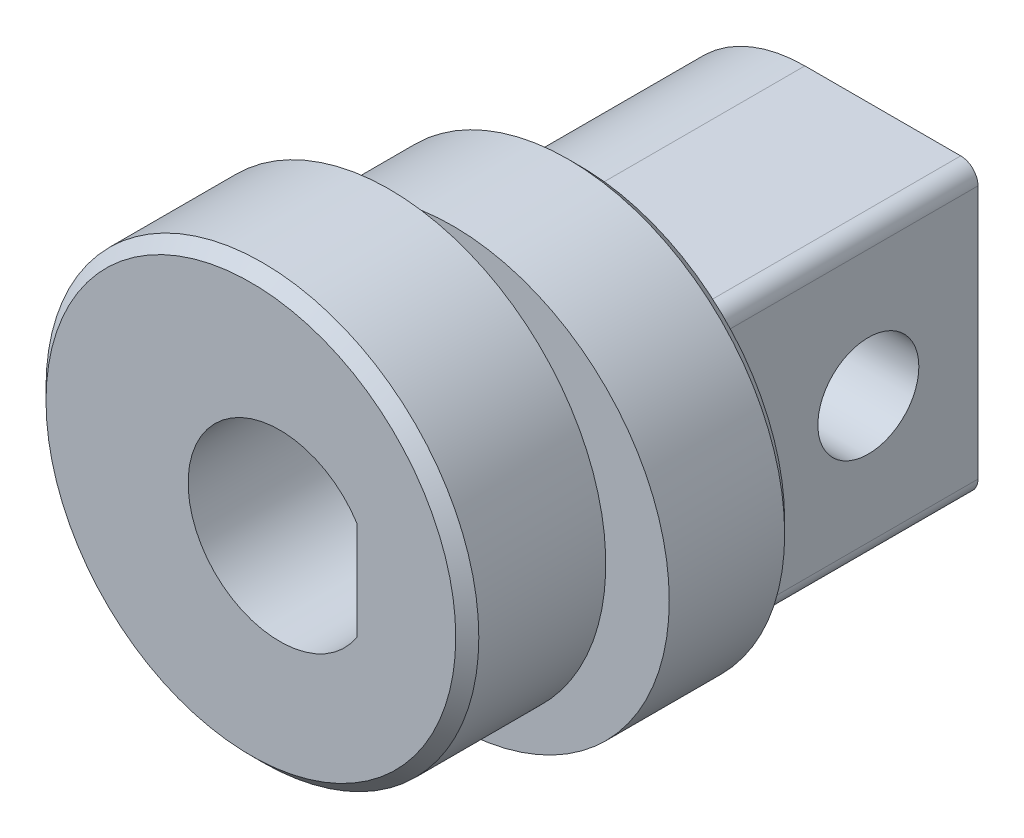
ISO-10303-21;
HEADER;
FILE_DESCRIPTION(('STEP AP214'),'2;1');
FILE_NAME('part.step','',(''),(''),'','','');
FILE_SCHEMA(('AUTOMOTIVE_DESIGN { 1 0 10303 214 1 1 1 1 }'));
ENDSEC;
DATA;
#1=APPLICATION_CONTEXT('core data for automotive mechanical design processes');
#2=APPLICATION_PROTOCOL_DEFINITION('international standard','automotive_design',2000,#1);
#3=PRODUCT_CONTEXT('',#1,'mechanical');
#4=PRODUCT('Part','Part','',(#3));
#5=PRODUCT_RELATED_PRODUCT_CATEGORY('part','',(#4));
#6=PRODUCT_DEFINITION_FORMATION('','',#4);
#7=PRODUCT_DEFINITION_CONTEXT('part definition',#1,'design');
#8=PRODUCT_DEFINITION('design','',#6,#7);
#9=PRODUCT_DEFINITION_SHAPE('','',#8);
#10=(LENGTH_UNIT() NAMED_UNIT(*) SI_UNIT(.MILLI.,.METRE.));
#11=(NAMED_UNIT(*) PLANE_ANGLE_UNIT() SI_UNIT($,.RADIAN.));
#12=(NAMED_UNIT(*) SI_UNIT($,.STERADIAN.) SOLID_ANGLE_UNIT());
#13=UNCERTAINTY_MEASURE_WITH_UNIT(LENGTH_MEASURE(1.E-05),#10,'distance_accuracy_value','');
#14=(GEOMETRIC_REPRESENTATION_CONTEXT(3) GLOBAL_UNCERTAINTY_ASSIGNED_CONTEXT((#13)) GLOBAL_UNIT_ASSIGNED_CONTEXT((#10,
#11,#12)) REPRESENTATION_CONTEXT('',''));
#15=CARTESIAN_POINT('',(0.,0.,0.));
#16=DIRECTION('',(0.,0.,1.));
#17=DIRECTION('',(1.,0.,0.));
#18=AXIS2_PLACEMENT_3D('',#15,#16,#17);
#19=CARTESIAN_POINT('',(2.675,-1.71026313764871,-8.79999999993873));
#20=DIRECTION('',(1.,0.,0.));
#21=DIRECTION('',(0.,0.,-1.));
#22=AXIS2_PLACEMENT_3D('',#19,#20,#21);
#23=PLANE('',#22);
#24=DIRECTION('',(0.,0.,1.));
#25=VECTOR('',#24,1.);
#26=CARTESIAN_POINT('',(2.675,1.71026313764871,-8.79999999993873));
#27=LINE('',#26,#25);
#28=CARTESIAN_POINT('',(2.675,1.71026313764871,-4.62919007564525));
#29=VERTEX_POINT('',#28);
#30=CARTESIAN_POINT('',(2.675,1.71026313764871,9.4));
#31=VERTEX_POINT('',#30);
#32=EDGE_CURVE('E148',#29,#31,#27,.T.);
#33=ORIENTED_EDGE('',*,*,#32,.F.);
#34=CARTESIAN_POINT('',(2.675,0.,-5.));
#35=DIRECTION('',(1.,0.,0.));
#36=DIRECTION('',(0.,0.,-1.));
#37=AXIS2_PLACEMENT_3D('',#34,#35,#36);
#38=CIRCLE('',#37,1.74999999999999);
#39=CARTESIAN_POINT('',(2.675,-1.71026313764871,-4.62919007564525));
#40=VERTEX_POINT('',#39);
#41=EDGE_CURVE('E61',#29,#40,#38,.T.);
#42=ORIENTED_EDGE('',*,*,#41,.T.);
#43=DIRECTION('',(0.,0.,1.));
#44=VECTOR('',#43,1.);
#45=CARTESIAN_POINT('',(2.675,-1.71026313764871,-8.79999999993873));
#46=LINE('',#45,#44);
#47=CARTESIAN_POINT('',(2.675,-1.71026313764871,9.4));
#48=VERTEX_POINT('',#47);
#49=EDGE_CURVE('E156',#40,#48,#46,.T.);
#50=ORIENTED_EDGE('',*,*,#49,.T.);
#51=DIRECTION('',(0.,1.,0.));
#52=VECTOR('',#51,1.);
#53=CARTESIAN_POINT('',(2.675,-1.71026313764871,9.4));
#54=LINE('',#53,#52);
#55=EDGE_CURVE('E154',#48,#31,#54,.T.);
#56=ORIENTED_EDGE('',*,*,#55,.T.);
#57=EDGE_LOOP('',(#33,#42,#50,#56));
#58=FACE_BOUND('',#57,.T.);
#59=ADVANCED_FACE('F45',(#58),#23,.F.);
#60=CARTESIAN_POINT('',(1.2,0.,0.200000000013279));
#61=DIRECTION('',(0.,0.,1.));
#62=DIRECTION('',(1.,0.,0.));
#63=AXIS2_PLACEMENT_3D('',#60,#61,#62);
#64=PLANE('',#63);
#65=CARTESIAN_POINT('',(1.2,0.,0.200000000013279));
#66=DIRECTION('',(0.,0.,1.));
#67=DIRECTION('',(1.,0.,0.));
#68=AXIS2_PLACEMENT_3D('',#65,#66,#67);
#69=CIRCLE('',#68,7.10000000004356);
#70=CARTESIAN_POINT('',(8.30000000004356,0.,0.200000000013279));
#71=VERTEX_POINT('',#70);
#72=EDGE_CURVE('E319',#71,#71,#69,.F.);
#73=ORIENTED_EDGE('',*,*,#72,.T.);
#74=EDGE_LOOP('',(#73));
#75=FACE_BOUND('',#74,.T.);
#76=CARTESIAN_POINT('',(5.4,4.4,0.200000000013279));
#77=DIRECTION('',(0.,0.,-1.));
#78=DIRECTION('',(1.,0.,0.));
#79=AXIS2_PLACEMENT_3D('',#76,#77,#78);
#80=CIRCLE('',#79,0.6);
#81=CARTESIAN_POINT('',(5.4,5.,0.200000000013279));
#82=VERTEX_POINT('',#81);
#83=CARTESIAN_POINT('',(6.,4.4,0.200000000013279));
#84=VERTEX_POINT('',#83);
#85=EDGE_CURVE('E159',#82,#84,#80,.T.);
#86=ORIENTED_EDGE('',*,*,#85,.F.);
#87=DIRECTION('',(1.,0.,0.));
#88=VECTOR('',#87,1.);
#89=CARTESIAN_POINT('',(5.4,5.,0.200000000013279));
#90=LINE('',#89,#88);
#91=CARTESIAN_POINT('',(0.,5.,0.200000000013279));
#92=VERTEX_POINT('',#91);
#93=EDGE_CURVE('E164',#92,#82,#90,.T.);
#94=ORIENTED_EDGE('',*,*,#93,.F.);
#95=CARTESIAN_POINT('',(0.,0.,0.200000000013279));
#96=DIRECTION('',(0.,0.,-1.));
#97=DIRECTION('',(1.,0.,0.));
#98=AXIS2_PLACEMENT_3D('',#95,#96,#97);
#99=CIRCLE('',#98,5.);
#100=CARTESIAN_POINT('',(0.,-5.,0.200000000013279));
#101=VERTEX_POINT('',#100);
#102=EDGE_CURVE('E186',#101,#92,#99,.T.);
#103=ORIENTED_EDGE('',*,*,#102,.F.);
#104=DIRECTION('',(-1.,0.,0.));
#105=VECTOR('',#104,1.);
#106=CARTESIAN_POINT('',(0.,-5.,0.200000000013279));
#107=LINE('',#106,#105);
#108=CARTESIAN_POINT('',(5.4,-5.,0.200000000013279));
#109=VERTEX_POINT('',#108);
#110=EDGE_CURVE('E183',#109,#101,#107,.T.);
#111=ORIENTED_EDGE('',*,*,#110,.F.);
#112=CARTESIAN_POINT('',(5.4,-4.4,0.200000000013279));
#113=DIRECTION('',(0.,0.,-1.));
#114=DIRECTION('',(1.,0.,0.));
#115=AXIS2_PLACEMENT_3D('',#112,#113,#114);
#116=CIRCLE('',#115,0.6);
#117=CARTESIAN_POINT('',(6.,-4.4,0.200000000013279));
#118=VERTEX_POINT('',#117);
#119=EDGE_CURVE('E180',#118,#109,#116,.T.);
#120=ORIENTED_EDGE('',*,*,#119,.F.);
#121=DIRECTION('',(0.,-1.,0.));
#122=VECTOR('',#121,1.);
#123=CARTESIAN_POINT('',(6.,-4.4,0.200000000013279));
#124=LINE('',#123,#122);
#125=EDGE_CURVE('E177',#84,#118,#124,.T.);
#126=ORIENTED_EDGE('',*,*,#125,.F.);
#127=EDGE_LOOP('',(#86,#94,#103,#111,#120,#126));
#128=FACE_BOUND('',#127,.T.);
#129=ADVANCED_FACE('F236',(#75,#128),#64,.F.);
#130=CARTESIAN_POINT('',(1.2,0.,0.200000000013279));
#131=DIRECTION('',(0.,0.,1.));
#132=DIRECTION('',(1.,0.,0.));
#133=AXIS2_PLACEMENT_3D('',#130,#131,#132);
#134=CYLINDRICAL_SURFACE('',#133,7.5);
#135=CARTESIAN_POINT('',(1.2,0.,0.600000000026559));
#136=DIRECTION('',(0.,0.,1.));
#137=DIRECTION('',(1.,0.,0.));
#138=AXIS2_PLACEMENT_3D('',#135,#136,#137);
#139=CIRCLE('',#138,7.5);
#140=CARTESIAN_POINT('',(8.7,0.,0.600000000026559));
#141=VERTEX_POINT('',#140);
#142=EDGE_CURVE('E322',#141,#141,#139,.T.);
#143=ORIENTED_EDGE('',*,*,#142,.T.);
#144=EDGE_LOOP('',(#143));
#145=FACE_BOUND('',#144,.T.);
#146=CARTESIAN_POINT('',(1.2,0.,4.6));
#147=DIRECTION('',(0.,0.,1.));
#148=DIRECTION('',(1.,0.,0.));
#149=AXIS2_PLACEMENT_3D('',#146,#147,#148);
#150=CIRCLE('',#149,7.5);
#151=CARTESIAN_POINT('',(0.099999999999997,7.41889479639656,4.6));
#152=VERTEX_POINT('',#151);
#153=CARTESIAN_POINT('',(0.099999999999997,-7.41889479639656,4.6));
#154=VERTEX_POINT('',#153);
#155=EDGE_CURVE('E134',#152,#154,#150,.T.);
#156=ORIENTED_EDGE('',*,*,#155,.F.);
#157=EDGE_CURVE('E208',#154,#152,#150,.T.);
#158=ORIENTED_EDGE('',*,*,#157,.F.);
#159=EDGE_LOOP('',(#156,#158));
#160=FACE_BOUND('',#159,.T.);
#161=ADVANCED_FACE('F243',(#145,#160),#134,.T.);
#162=CARTESIAN_POINT('',(1.2,0.,4.6));
#163=DIRECTION('',(0.,0.,1.));
#164=DIRECTION('',(1.,0.,0.));
#165=AXIS2_PLACEMENT_3D('',#162,#163,#164);
#166=PLANE('',#165);
#167=ORIENTED_EDGE('',*,*,#157,.T.);
#168=CARTESIAN_POINT('',(-1.,0.,4.6));
#169=DIRECTION('',(0.,0.,-1.));
#170=DIRECTION('',(-1.,0.,0.));
#171=AXIS2_PLACEMENT_3D('',#168,#169,#170);
#172=CIRCLE('',#171,7.5);
#173=EDGE_CURVE('E150',#152,#154,#172,.T.);
#174=ORIENTED_EDGE('',*,*,#173,.T.);
#175=EDGE_LOOP('',(#167,#174));
#176=FACE_BOUND('',#175,.T.);
#177=ADVANCED_FACE('F300',(#176),#166,.T.);
#178=CARTESIAN_POINT('',(5.4,4.4,-8.79999999993873));
#179=DIRECTION('',(0.,0.,1.));
#180=DIRECTION('',(1.,0.,0.));
#181=AXIS2_PLACEMENT_3D('',#178,#179,#180);
#182=CYLINDRICAL_SURFACE('',#181,0.6);
#183=ORIENTED_EDGE('',*,*,#85,.T.);
#184=DIRECTION('',(0.,0.,1.));
#185=VECTOR('',#184,1.);
#186=CARTESIAN_POINT('',(6.,4.4,-8.79999999993873));
#187=LINE('',#186,#185);
#188=CARTESIAN_POINT('',(6.,4.4,-8.79999999993873));
#189=VERTEX_POINT('',#188);
#190=EDGE_CURVE('E205',#189,#84,#187,.T.);
#191=ORIENTED_EDGE('',*,*,#190,.F.);
#192=CARTESIAN_POINT('',(5.4,4.4,-8.79999999993873));
#193=DIRECTION('',(0.,0.,-1.));
#194=DIRECTION('',(1.,0.,0.));
#195=AXIS2_PLACEMENT_3D('',#192,#193,#194);
#196=CIRCLE('',#195,0.6);
#197=CARTESIAN_POINT('',(5.4,5.,-8.79999999993873));
#198=VERTEX_POINT('',#197);
#199=EDGE_CURVE('E160',#198,#189,#196,.T.);
#200=ORIENTED_EDGE('',*,*,#199,.F.);
#201=DIRECTION('',(0.,0.,1.));
#202=VECTOR('',#201,1.);
#203=CARTESIAN_POINT('',(5.4,5.,-8.79999999993873));
#204=LINE('',#203,#202);
#205=EDGE_CURVE('E174',#198,#82,#204,.T.);
#206=ORIENTED_EDGE('',*,*,#205,.T.);
#207=EDGE_LOOP('',(#183,#191,#200,#206));
#208=FACE_BOUND('',#207,.T.);
#209=ADVANCED_FACE('F264',(#208),#182,.T.);
#210=CARTESIAN_POINT('',(6.,-4.4,-8.79999999993873));
#211=DIRECTION('',(-1.,0.,0.));
#212=DIRECTION('',(0.,0.,1.));
#213=AXIS2_PLACEMENT_3D('',#210,#211,#212);
#214=PLANE('',#213);
#215=CARTESIAN_POINT('',(6.,0.,-5.));
#216=DIRECTION('',(1.,0.,0.));
#217=DIRECTION('',(0.,0.,-1.));
#218=AXIS2_PLACEMENT_3D('',#215,#216,#217);
#219=CIRCLE('',#218,1.74999999999999);
#220=CARTESIAN_POINT('',(6.,0.,-6.74999999999999));
#221=VERTEX_POINT('',#220);
#222=EDGE_CURVE('E143',#221,#221,#219,.T.);
#223=ORIENTED_EDGE('',*,*,#222,.F.);
#224=EDGE_LOOP('',(#223));
#225=FACE_BOUND('',#224,.T.);
#226=ORIENTED_EDGE('',*,*,#125,.T.);
#227=DIRECTION('',(0.,0.,1.));
#228=VECTOR('',#227,1.);
#229=CARTESIAN_POINT('',(6.,-4.4,-8.79999999993873));
#230=LINE('',#229,#228);
#231=CARTESIAN_POINT('',(6.,-4.4,-8.79999999993873));
#232=VERTEX_POINT('',#231);
#233=EDGE_CURVE('E202',#232,#118,#230,.T.);
#234=ORIENTED_EDGE('',*,*,#233,.F.);
#235=DIRECTION('',(0.,-1.,0.));
#236=VECTOR('',#235,1.);
#237=CARTESIAN_POINT('',(6.,-4.4,-8.79999999993873));
#238=LINE('',#237,#236);
#239=EDGE_CURVE('E163',#189,#232,#238,.T.);
#240=ORIENTED_EDGE('',*,*,#239,.F.);
#241=ORIENTED_EDGE('',*,*,#190,.T.);
#242=EDGE_LOOP('',(#226,#234,#240,#241));
#243=FACE_BOUND('',#242,.T.);
#244=ADVANCED_FACE('F261',(#225,#243),#214,.F.);
#245=CARTESIAN_POINT('',(5.4,-4.4,-8.79999999993873));
#246=DIRECTION('',(0.,0.,1.));
#247=DIRECTION('',(1.,0.,0.));
#248=AXIS2_PLACEMENT_3D('',#245,#246,#247);
#249=CYLINDRICAL_SURFACE('',#248,0.6);
#250=ORIENTED_EDGE('',*,*,#119,.T.);
#251=DIRECTION('',(0.,0.,1.));
#252=VECTOR('',#251,1.);
#253=CARTESIAN_POINT('',(5.4,-5.,-8.79999999993873));
#254=LINE('',#253,#252);
#255=CARTESIAN_POINT('',(5.4,-5.,-8.79999999993873));
#256=VERTEX_POINT('',#255);
#257=EDGE_CURVE('E199',#256,#109,#254,.T.);
#258=ORIENTED_EDGE('',*,*,#257,.F.);
#259=CARTESIAN_POINT('',(5.4,-4.4,-8.79999999993873));
#260=DIRECTION('',(0.,0.,-1.));
#261=DIRECTION('',(1.,0.,0.));
#262=AXIS2_PLACEMENT_3D('',#259,#260,#261);
#263=CIRCLE('',#262,0.6);
#264=EDGE_CURVE('E166',#232,#256,#263,.T.);
#265=ORIENTED_EDGE('',*,*,#264,.F.);
#266=ORIENTED_EDGE('',*,*,#233,.T.);
#267=EDGE_LOOP('',(#250,#258,#265,#266));
#268=FACE_BOUND('',#267,.T.);
#269=ADVANCED_FACE('F263',(#268),#249,.T.);
#270=CARTESIAN_POINT('',(0.,-5.,-8.79999999993873));
#271=DIRECTION('',(0.,1.,0.));
#272=DIRECTION('',(0.,0.,1.));
#273=AXIS2_PLACEMENT_3D('',#270,#271,#272);
#274=PLANE('',#273);
#275=ORIENTED_EDGE('',*,*,#110,.T.);
#276=DIRECTION('',(0.,0.,1.));
#277=VECTOR('',#276,1.);
#278=CARTESIAN_POINT('',(0.,-5.,-8.79999999993873));
#279=LINE('',#278,#277);
#280=CARTESIAN_POINT('',(0.,-5.,-8.79999999993873));
#281=VERTEX_POINT('',#280);
#282=EDGE_CURVE('E196',#281,#101,#279,.T.);
#283=ORIENTED_EDGE('',*,*,#282,.F.);
#284=DIRECTION('',(-1.,0.,0.));
#285=VECTOR('',#284,1.);
#286=CARTESIAN_POINT('',(0.,-5.,-8.79999999993873));
#287=LINE('',#286,#285);
#288=EDGE_CURVE('E168',#256,#281,#287,.T.);
#289=ORIENTED_EDGE('',*,*,#288,.F.);
#290=ORIENTED_EDGE('',*,*,#257,.T.);
#291=EDGE_LOOP('',(#275,#283,#289,#290));
#292=FACE_BOUND('',#291,.T.);
#293=ADVANCED_FACE('F287',(#292),#274,.F.);
#294=CARTESIAN_POINT('',(0.,0.,-8.79999999993873));
#295=DIRECTION('',(0.,0.,1.));
#296=DIRECTION('',(1.,0.,0.));
#297=AXIS2_PLACEMENT_3D('',#294,#295,#296);
#298=CYLINDRICAL_SURFACE('',#297,5.);
#299=ORIENTED_EDGE('',*,*,#102,.T.);
#300=DIRECTION('',(0.,0.,1.));
#301=VECTOR('',#300,1.);
#302=CARTESIAN_POINT('',(0.,5.,-8.79999999993873));
#303=LINE('',#302,#301);
#304=CARTESIAN_POINT('',(0.,5.,-8.79999999993873));
#305=VERTEX_POINT('',#304);
#306=EDGE_CURVE('E193',#305,#92,#303,.T.);
#307=ORIENTED_EDGE('',*,*,#306,.F.);
#308=CARTESIAN_POINT('',(0.,0.,-8.79999999993873));
#309=DIRECTION('',(0.,0.,-1.));
#310=DIRECTION('',(1.,0.,0.));
#311=AXIS2_PLACEMENT_3D('',#308,#309,#310);
#312=CIRCLE('',#311,5.);
#313=EDGE_CURVE('E170',#281,#305,#312,.T.);
#314=ORIENTED_EDGE('',*,*,#313,.F.);
#315=ORIENTED_EDGE('',*,*,#282,.T.);
#316=EDGE_LOOP('',(#299,#307,#314,#315));
#317=FACE_BOUND('',#316,.T.);
#318=ADVANCED_FACE('F285',(#317),#298,.T.);
#319=CARTESIAN_POINT('',(5.4,5.,-8.79999999993873));
#320=DIRECTION('',(0.,-1.,0.));
#321=DIRECTION('',(0.,0.,-1.));
#322=AXIS2_PLACEMENT_3D('',#319,#320,#321);
#323=PLANE('',#322);
#324=ORIENTED_EDGE('',*,*,#93,.T.);
#325=ORIENTED_EDGE('',*,*,#205,.F.);
#326=DIRECTION('',(1.,0.,0.));
#327=VECTOR('',#326,1.);
#328=CARTESIAN_POINT('',(5.4,5.,-8.79999999993873));
#329=LINE('',#328,#327);
#330=EDGE_CURVE('E172',#305,#198,#329,.T.);
#331=ORIENTED_EDGE('',*,*,#330,.F.);
#332=ORIENTED_EDGE('',*,*,#306,.T.);
#333=EDGE_LOOP('',(#324,#325,#331,#332));
#334=FACE_BOUND('',#333,.T.);
#335=ADVANCED_FACE('F281',(#334),#323,.F.);
#336=CARTESIAN_POINT('',(5.4,4.4,-8.79999999993873));
#337=DIRECTION('',(0.,0.,1.));
#338=DIRECTION('',(1.,0.,0.));
#339=AXIS2_PLACEMENT_3D('',#336,#337,#338);
#340=PLANE('',#339);
#341=DIRECTION('',(0.,1.,0.));
#342=VECTOR('',#341,1.);
#343=CARTESIAN_POINT('',(2.675,-1.71026313764871,-8.79999999993873));
#344=LINE('',#343,#342);
#345=CARTESIAN_POINT('',(2.675,-1.71026313764871,-8.79999999993873));
#346=VERTEX_POINT('',#345);
#347=CARTESIAN_POINT('',(2.675,1.71026313764871,-8.79999999993873));
#348=VERTEX_POINT('',#347);
#349=EDGE_CURVE('E253',#346,#348,#344,.T.);
#350=ORIENTED_EDGE('',*,*,#349,.T.);
#351=CARTESIAN_POINT('',(0.,0.,-8.79999999993873));
#352=DIRECTION('',(0.,0.,1.));
#353=DIRECTION('',(1.,0.,0.));
#354=AXIS2_PLACEMENT_3D('',#351,#352,#353);
#355=CIRCLE('',#354,3.175);
#356=EDGE_CURVE('E69',#348,#346,#355,.T.);
#357=ORIENTED_EDGE('',*,*,#356,.T.);
#358=EDGE_LOOP('',(#350,#357));
#359=FACE_BOUND('',#358,.T.);
#360=ORIENTED_EDGE('',*,*,#199,.T.);
#361=ORIENTED_EDGE('',*,*,#239,.T.);
#362=ORIENTED_EDGE('',*,*,#264,.T.);
#363=ORIENTED_EDGE('',*,*,#288,.T.);
#364=ORIENTED_EDGE('',*,*,#313,.T.);
#365=ORIENTED_EDGE('',*,*,#330,.T.);
#366=EDGE_LOOP('',(#360,#361,#362,#363,#364,#365));
#367=FACE_BOUND('',#366,.T.);
#368=ADVANCED_FACE('F274',(#359,#367),#340,.F.);
#369=CARTESIAN_POINT('',(-1.,0.,9.4));
#370=DIRECTION('',(0.,0.,-1.));
#371=DIRECTION('',(-1.,0.,0.));
#372=AXIS2_PLACEMENT_3D('',#369,#370,#371);
#373=CYLINDRICAL_SURFACE('',#372,7.5);
#374=CARTESIAN_POINT('',(-1.,0.,8.99999999998673));
#375=DIRECTION('',(0.,0.,-1.));
#376=DIRECTION('',(-1.,0.,0.));
#377=AXIS2_PLACEMENT_3D('',#374,#375,#376);
#378=CIRCLE('',#377,7.5);
#379=CARTESIAN_POINT('',(-8.5,0.,8.99999999998673));
#380=VERTEX_POINT('',#379);
#381=EDGE_CURVE('E54',#380,#380,#378,.T.);
#382=ORIENTED_EDGE('',*,*,#381,.T.);
#383=EDGE_LOOP('',(#382));
#384=FACE_BOUND('',#383,.T.);
#385=ORIENTED_EDGE('',*,*,#173,.F.);
#386=EDGE_CURVE('E147',#154,#152,#172,.T.);
#387=ORIENTED_EDGE('',*,*,#386,.F.);
#388=EDGE_LOOP('',(#385,#387));
#389=FACE_BOUND('',#388,.T.);
#390=ADVANCED_FACE('F327',(#384,#389),#373,.T.);
#391=CARTESIAN_POINT('',(-1.,0.,9.4));
#392=DIRECTION('',(0.,0.,-1.));
#393=DIRECTION('',(-1.,0.,0.));
#394=AXIS2_PLACEMENT_3D('',#391,#392,#393);
#395=PLANE('',#394);
#396=CARTESIAN_POINT('',(-1.,0.,9.4));
#397=DIRECTION('',(0.,0.,-1.));
#398=DIRECTION('',(-1.,0.,0.));
#399=AXIS2_PLACEMENT_3D('',#396,#397,#398);
#400=CIRCLE('',#399,7.10000000004357);
#401=CARTESIAN_POINT('',(-8.10000000004356,0.,9.4));
#402=VERTEX_POINT('',#401);
#403=EDGE_CURVE('E11',#402,#402,#400,.F.);
#404=ORIENTED_EDGE('',*,*,#403,.T.);
#405=EDGE_LOOP('',(#404));
#406=FACE_BOUND('',#405,.T.);
#407=ORIENTED_EDGE('',*,*,#55,.F.);
#408=CARTESIAN_POINT('',(0.,0.,9.4));
#409=DIRECTION('',(0.,0.,1.));
#410=DIRECTION('',(1.,0.,0.));
#411=AXIS2_PLACEMENT_3D('',#408,#409,#410);
#412=CIRCLE('',#411,3.175);
#413=EDGE_CURVE('E250',#31,#48,#412,.T.);
#414=ORIENTED_EDGE('',*,*,#413,.F.);
#415=EDGE_LOOP('',(#407,#414));
#416=FACE_BOUND('',#415,.T.);
#417=ADVANCED_FACE('F252',(#406,#416),#395,.F.);
#418=CARTESIAN_POINT('',(-1.,0.,4.6));
#419=DIRECTION('',(0.,0.,-1.));
#420=DIRECTION('',(-1.,0.,0.));
#421=AXIS2_PLACEMENT_3D('',#418,#419,#420);
#422=PLANE('',#421);
#423=ORIENTED_EDGE('',*,*,#386,.T.);
#424=ORIENTED_EDGE('',*,*,#155,.T.);
#425=EDGE_LOOP('',(#423,#424));
#426=FACE_BOUND('',#425,.T.);
#427=ADVANCED_FACE('F234',(#426),#422,.T.);
#428=CARTESIAN_POINT('',(0.,0.,-8.79999999993873));
#429=DIRECTION('',(0.,0.,1.));
#430=DIRECTION('',(1.,0.,0.));
#431=AXIS2_PLACEMENT_3D('',#428,#429,#430);
#432=CYLINDRICAL_SURFACE('',#431,3.175);
#433=ORIENTED_EDGE('',*,*,#49,.F.);
#434=CARTESIAN_POINT('',(2.675,-1.71026313764871,-4.62919007564525));
#435=CARTESIAN_POINT('',(2.66931595131974,-1.71914291183198,-4.6701129884019));
#436=CARTESIAN_POINT('',(2.66451317746818,-1.72656735485524,-4.71148141541787));
#437=CARTESIAN_POINT('',(2.65678582824831,-1.73844013445689,-4.79483539326971));
#438=CARTESIAN_POINT('',(2.6538621334927,-1.74288707569788,-4.83682122403208));
#439=CARTESIAN_POINT('',(2.65005461833637,-1.74866948172332,-4.92021060100646));
#440=CARTESIAN_POINT('',(2.64912917133121,-1.7500684463132,-4.96160781094797));
#441=CARTESIAN_POINT('',(2.64922300498485,-1.74992644253276,-5.0443737106878));
#442=CARTESIAN_POINT('',(2.65024127590606,-1.74838700062854,-5.08574240413227));
#443=CARTESIAN_POINT('',(2.65417367295031,-1.7424126243837,-5.1678677082696));
#444=CARTESIAN_POINT('',(2.65707368360625,-1.73799924737897,-5.20862658301195));
#445=CARTESIAN_POINT('',(2.66468683922988,-1.72629934856114,-5.29000709820904));
#446=CARTESIAN_POINT('',(2.66941898737159,-1.71898269307232,-5.33062264138255));
#447=CARTESIAN_POINT('',(2.675,-1.71026313764871,-5.37080992435475));
#448=B_SPLINE_CURVE_WITH_KNOTS('',3,(#434,#435,#436,#437,#438,#439,#440,#441,#442,#443,#444,
#445,#446,#447),.UNSPECIFIED.,.F.,.F.,(4,2,2,2,2,2,4),(0.,0.126752598594612,0.25356455536906,
0.377708261956084,0.501787494963726,0.62494656916858,0.749418850100627),.UNSPECIFIED.);
#449=CARTESIAN_POINT('',(2.675,-1.71026313764871,-5.37080992435475));
#450=VERTEX_POINT('',#449);
#451=EDGE_CURVE('E133',#40,#450,#448,.T.);
#452=ORIENTED_EDGE('',*,*,#451,.T.);
#453=EDGE_CURVE('E142',#346,#450,#46,.T.);
#454=ORIENTED_EDGE('',*,*,#453,.F.);
#455=ORIENTED_EDGE('',*,*,#356,.F.);
#456=CARTESIAN_POINT('',(2.675,1.71026313764871,-5.37080992435475));
#457=VERTEX_POINT('',#456);
#458=EDGE_CURVE('E140',#348,#457,#27,.T.);
#459=ORIENTED_EDGE('',*,*,#458,.T.);
#460=CARTESIAN_POINT('',(2.675,1.71026313764871,-5.37080992435475));
#461=CARTESIAN_POINT('',(2.66931595131974,1.71914291183198,-5.3298870115981));
#462=CARTESIAN_POINT('',(2.66451317746818,1.72656735485524,-5.28851858458213));
#463=CARTESIAN_POINT('',(2.65678582824831,1.73844013445689,-5.20516460673029));
#464=CARTESIAN_POINT('',(2.6538621334927,1.74288707569788,-5.16317877596792));
#465=CARTESIAN_POINT('',(2.65005461833637,1.74866948172332,-5.07978939899354));
#466=CARTESIAN_POINT('',(2.64912917133122,1.7500684463132,-5.03839218905203));
#467=CARTESIAN_POINT('',(2.64922300498485,1.74992644253276,-4.9556262893122));
#468=CARTESIAN_POINT('',(2.65024127590606,1.74838700062854,-4.91425759586773));
#469=CARTESIAN_POINT('',(2.65417367295031,1.7424126243837,-4.8321322917304));
#470=CARTESIAN_POINT('',(2.65707368360625,1.73799924737897,-4.79137341698805));
#471=CARTESIAN_POINT('',(2.66468683922988,1.72629934856114,-4.70999290179096));
#472=CARTESIAN_POINT('',(2.66941898737159,1.71898269307232,-4.66937735861745));
#473=CARTESIAN_POINT('',(2.675,1.71026313764871,-4.62919007564525));
#474=B_SPLINE_CURVE_WITH_KNOTS('',3,(#460,#461,#462,#463,#464,#465,#466,#467,#468,#469,#470,
#471,#472,#473),.UNSPECIFIED.,.F.,.F.,(4,2,2,2,2,2,4),(0.,0.126752598594613,0.253564555369061,
0.377708261956085,0.501787494963727,0.624946569168583,0.749418850100633),.UNSPECIFIED.);
#475=EDGE_CURVE('E127',#457,#29,#474,.T.);
#476=ORIENTED_EDGE('',*,*,#475,.T.);
#477=ORIENTED_EDGE('',*,*,#32,.T.);
#478=ORIENTED_EDGE('',*,*,#413,.T.);
#479=EDGE_LOOP('',(#433,#452,#454,#455,#459,#476,#477,#478));
#480=FACE_BOUND('',#479,.T.);
#481=ADVANCED_FACE('F146',(#480),#432,.F.);
#482=ORIENTED_EDGE('',*,*,#453,.T.);
#483=EDGE_CURVE('E130',#450,#457,#38,.T.);
#484=ORIENTED_EDGE('',*,*,#483,.T.);
#485=ORIENTED_EDGE('',*,*,#458,.F.);
#486=ORIENTED_EDGE('',*,*,#349,.F.);
#487=EDGE_LOOP('',(#482,#484,#485,#486));
#488=FACE_BOUND('',#487,.T.);
#489=ADVANCED_FACE('F138',(#488),#23,.F.);
#490=CARTESIAN_POINT('',(6.,0.,-5.));
#491=DIRECTION('',(1.,0.,0.));
#492=DIRECTION('',(0.,0.,-1.));
#493=AXIS2_PLACEMENT_3D('',#490,#491,#492);
#494=CYLINDRICAL_SURFACE('',#493,1.74999999999999);
#495=ORIENTED_EDGE('',*,*,#222,.T.);
#496=EDGE_LOOP('',(#495));
#497=FACE_BOUND('',#496,.T.);
#498=ORIENTED_EDGE('',*,*,#41,.F.);
#499=ORIENTED_EDGE('',*,*,#475,.F.);
#500=ORIENTED_EDGE('',*,*,#483,.F.);
#501=ORIENTED_EDGE('',*,*,#451,.F.);
#502=EDGE_LOOP('',(#498,#499,#500,#501));
#503=FACE_BOUND('',#502,.T.);
#504=ADVANCED_FACE('F129',(#497,#503),#494,.F.);
#505=CARTESIAN_POINT('',(1.2,0.,0.600000000026559));
#506=DIRECTION('',(0.,0.,1.));
#507=DIRECTION('',(1.,0.,0.));
#508=AXIS2_PLACEMENT_3D('',#505,#506,#507);
#509=CONICAL_SURFACE('',#508,7.5,0.785398163326401);
#510=ORIENTED_EDGE('',*,*,#72,.F.);
#511=EDGE_LOOP('',(#510));
#512=FACE_BOUND('',#511,.T.);
#513=ORIENTED_EDGE('',*,*,#142,.F.);
#514=EDGE_LOOP('',(#513));
#515=FACE_BOUND('',#514,.T.);
#516=ADVANCED_FACE('F227',(#512,#515),#509,.T.);
#517=CARTESIAN_POINT('',(-1.,0.,8.99999999998673));
#518=DIRECTION('',(0.,0.,-1.));
#519=DIRECTION('',(-1.,0.,0.));
#520=AXIS2_PLACEMENT_3D('',#517,#518,#519);
#521=CONICAL_SURFACE('',#520,7.5,0.785398163326403);
#522=ORIENTED_EDGE('',*,*,#403,.F.);
#523=EDGE_LOOP('',(#522));
#524=FACE_BOUND('',#523,.T.);
#525=ORIENTED_EDGE('',*,*,#381,.F.);
#526=EDGE_LOOP('',(#525));
#527=FACE_BOUND('',#526,.T.);
#528=ADVANCED_FACE('F48',(#524,#527),#521,.T.);
#529=CLOSED_SHELL('',(#59,#129,#161,#177,#209,#244,#269,#293,#318,#335,#368,#390,#417,#427,#481,
#489,#504,#516,#528));
#530=MANIFOLD_SOLID_BREP('B2',#529);
#531=ADVANCED_BREP_SHAPE_REPRESENTATION('',(#18,#530),#14);
#532=SHAPE_DEFINITION_REPRESENTATION(#9,#531);
ENDSEC;
END-ISO-10303-21;
